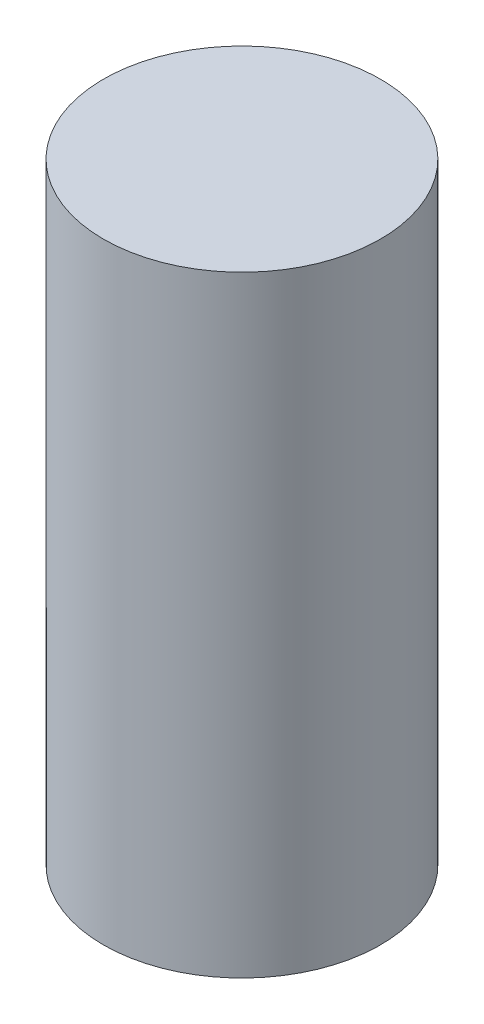
ISO-10303-21;
HEADER;
FILE_DESCRIPTION(('STEP AP214'),'2;1');
FILE_NAME('part.step','',(''),(''),'','','');
FILE_SCHEMA(('AUTOMOTIVE_DESIGN { 1 0 10303 214 1 1 1 1 }'));
ENDSEC;
DATA;
#1=APPLICATION_CONTEXT('core data for automotive mechanical design processes');
#2=APPLICATION_PROTOCOL_DEFINITION('international standard','automotive_design',2000,#1);
#3=PRODUCT_CONTEXT('',#1,'mechanical');
#4=PRODUCT('Part','Part','',(#3));
#5=PRODUCT_RELATED_PRODUCT_CATEGORY('part','',(#4));
#6=PRODUCT_DEFINITION_FORMATION('','',#4);
#7=PRODUCT_DEFINITION_CONTEXT('part definition',#1,'design');
#8=PRODUCT_DEFINITION('design','',#6,#7);
#9=PRODUCT_DEFINITION_SHAPE('','',#8);
#10=(LENGTH_UNIT() NAMED_UNIT(*) SI_UNIT(.MILLI.,.METRE.));
#11=(NAMED_UNIT(*) PLANE_ANGLE_UNIT() SI_UNIT($,.RADIAN.));
#12=(NAMED_UNIT(*) SI_UNIT($,.STERADIAN.) SOLID_ANGLE_UNIT());
#13=UNCERTAINTY_MEASURE_WITH_UNIT(LENGTH_MEASURE(1.E-05),#10,'distance_accuracy_value','');
#14=(GEOMETRIC_REPRESENTATION_CONTEXT(3) GLOBAL_UNCERTAINTY_ASSIGNED_CONTEXT((#13)) GLOBAL_UNIT_ASSIGNED_CONTEXT((#10,
#11,#12)) REPRESENTATION_CONTEXT('',''));
#15=CARTESIAN_POINT('',(0.,0.,0.));
#16=DIRECTION('',(0.,0.,1.));
#17=DIRECTION('',(1.,0.,0.));
#18=AXIS2_PLACEMENT_3D('',#15,#16,#17);
#19=CARTESIAN_POINT('',(0.,300.,0.));
#20=DIRECTION('',(0.,-1.,0.));
#21=DIRECTION('',(0.,0.,-1.));
#22=AXIS2_PLACEMENT_3D('',#19,#20,#21);
#23=CYLINDRICAL_SURFACE('',#22,68.);
#24=CARTESIAN_POINT('',(0.,300.,0.));
#25=DIRECTION('',(0.,1.,0.));
#26=DIRECTION('',(0.,0.,1.));
#27=AXIS2_PLACEMENT_3D('',#24,#25,#26);
#28=CIRCLE('',#27,68.);
#29=CARTESIAN_POINT('',(0.,300.,68.));
#30=VERTEX_POINT('',#29);
#31=EDGE_CURVE('E10',#30,#30,#28,.T.);
#32=ORIENTED_EDGE('',*,*,#31,.F.);
#33=EDGE_LOOP('',(#32));
#34=FACE_BOUND('',#33,.T.);
#35=CARTESIAN_POINT('',(0.,0.,0.));
#36=DIRECTION('',(0.,1.,0.));
#37=DIRECTION('',(0.,0.,1.));
#38=AXIS2_PLACEMENT_3D('',#35,#36,#37);
#39=CIRCLE('',#38,68.);
#40=CARTESIAN_POINT('',(0.,0.,68.));
#41=VERTEX_POINT('',#40);
#42=EDGE_CURVE('E38',#41,#41,#39,.T.);
#43=ORIENTED_EDGE('',*,*,#42,.T.);
#44=EDGE_LOOP('',(#43));
#45=FACE_BOUND('',#44,.T.);
#46=ADVANCED_FACE('F35',(#34,#45),#23,.T.);
#47=CARTESIAN_POINT('',(0.,300.,0.));
#48=DIRECTION('',(0.,1.,0.));
#49=DIRECTION('',(0.,0.,1.));
#50=AXIS2_PLACEMENT_3D('',#47,#48,#49);
#51=PLANE('',#50);
#52=ORIENTED_EDGE('',*,*,#31,.T.);
#53=EDGE_LOOP('',(#52));
#54=FACE_BOUND('',#53,.T.);
#55=ADVANCED_FACE('F50',(#54),#51,.T.);
#56=CARTESIAN_POINT('',(0.,0.,0.));
#57=DIRECTION('',(0.,1.,0.));
#58=DIRECTION('',(0.,0.,1.));
#59=AXIS2_PLACEMENT_3D('',#56,#57,#58);
#60=PLANE('',#59);
#61=ORIENTED_EDGE('',*,*,#42,.F.);
#62=EDGE_LOOP('',(#61));
#63=FACE_BOUND('',#62,.T.);
#64=ADVANCED_FACE('F48',(#63),#60,.F.);
#65=CLOSED_SHELL('',(#46,#55,#64));
#66=MANIFOLD_SOLID_BREP('B2',#65);
#67=ADVANCED_BREP_SHAPE_REPRESENTATION('',(#18,#66),#14);
#68=SHAPE_DEFINITION_REPRESENTATION(#9,#67);
ENDSEC;
END-ISO-10303-21;
